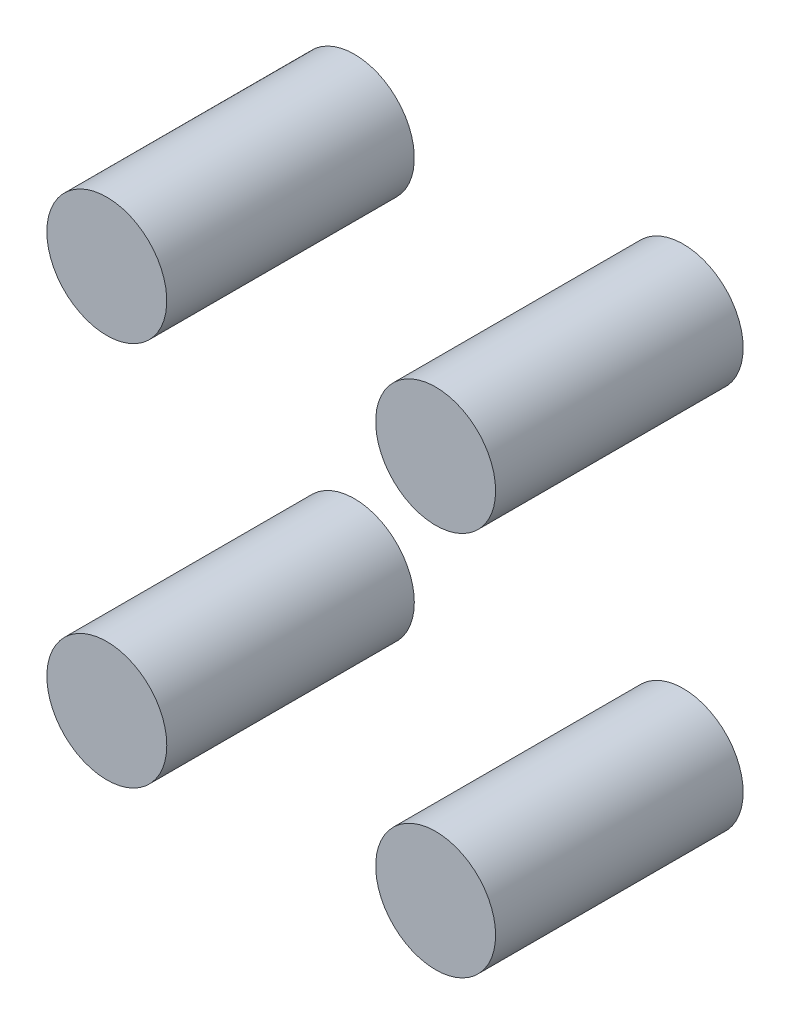
ISO-10303-21;
HEADER;
FILE_DESCRIPTION(('STEP AP214'),'2;1');
FILE_NAME('part.step','',(''),(''),'','','');
FILE_SCHEMA(('AUTOMOTIVE_DESIGN { 1 0 10303 214 1 1 1 1 }'));
ENDSEC;
DATA;
#1=APPLICATION_CONTEXT('core data for automotive mechanical design processes');
#2=APPLICATION_PROTOCOL_DEFINITION('international standard','automotive_design',2000,#1);
#3=PRODUCT_CONTEXT('',#1,'mechanical');
#4=PRODUCT('Part','Part','',(#3));
#5=PRODUCT_RELATED_PRODUCT_CATEGORY('part','',(#4));
#6=PRODUCT_DEFINITION_FORMATION('','',#4);
#7=PRODUCT_DEFINITION_CONTEXT('part definition',#1,'design');
#8=PRODUCT_DEFINITION('design','',#6,#7);
#9=PRODUCT_DEFINITION_SHAPE('','',#8);
#10=(LENGTH_UNIT() NAMED_UNIT(*) SI_UNIT(.MILLI.,.METRE.));
#11=(NAMED_UNIT(*) PLANE_ANGLE_UNIT() SI_UNIT($,.RADIAN.));
#12=(NAMED_UNIT(*) SI_UNIT($,.STERADIAN.) SOLID_ANGLE_UNIT());
#13=UNCERTAINTY_MEASURE_WITH_UNIT(LENGTH_MEASURE(1.E-05),#10,'distance_accuracy_value','');
#14=(GEOMETRIC_REPRESENTATION_CONTEXT(3) GLOBAL_UNCERTAINTY_ASSIGNED_CONTEXT((#13)) GLOBAL_UNIT_ASSIGNED_CONTEXT((#10,
#11,#12)) REPRESENTATION_CONTEXT('',''));
#15=CARTESIAN_POINT('',(0.,0.,0.));
#16=DIRECTION('',(0.,0.,1.));
#17=DIRECTION('',(1.,0.,0.));
#18=AXIS2_PLACEMENT_3D('',#15,#16,#17);
#19=CARTESIAN_POINT('',(-0.316192677665861,0.0503674559625203,40.));
#20=DIRECTION('',(0.,0.,-1.));
#21=DIRECTION('',(-1.,0.,0.));
#22=AXIS2_PLACEMENT_3D('',#19,#20,#21);
#23=CYLINDRICAL_SURFACE('',#22,9.68889965321614);
#24=CARTESIAN_POINT('',(-0.316192677665861,0.0503674559625203,40.));
#25=DIRECTION('',(0.,0.,1.));
#26=DIRECTION('',(1.,0.,0.));
#27=AXIS2_PLACEMENT_3D('',#24,#25,#26);
#28=CIRCLE('',#27,9.68889965321614);
#29=CARTESIAN_POINT('',(9.37270697555028,0.0503674559625203,40.));
#30=VERTEX_POINT('',#29);
#31=EDGE_CURVE('E48',#30,#30,#28,.T.);
#32=ORIENTED_EDGE('',*,*,#31,.F.);
#33=EDGE_LOOP('',(#32));
#34=FACE_BOUND('',#33,.T.);
#35=CARTESIAN_POINT('',(-0.316192677665861,0.0503674559625203,0.));
#36=DIRECTION('',(0.,0.,1.));
#37=DIRECTION('',(1.,0.,0.));
#38=AXIS2_PLACEMENT_3D('',#35,#36,#37);
#39=CIRCLE('',#38,9.68889965321614);
#40=CARTESIAN_POINT('',(9.37270697555028,0.0503674559625203,0.));
#41=VERTEX_POINT('',#40);
#42=EDGE_CURVE('E11',#41,#41,#39,.T.);
#43=ORIENTED_EDGE('',*,*,#42,.T.);
#44=EDGE_LOOP('',(#43));
#45=FACE_BOUND('',#44,.T.);
#46=ADVANCED_FACE('F44',(#34,#45),#23,.T.);
#47=CARTESIAN_POINT('',(-0.316192677665861,0.0503674559625203,40.));
#48=DIRECTION('',(0.,0.,1.));
#49=DIRECTION('',(1.,0.,0.));
#50=AXIS2_PLACEMENT_3D('',#47,#48,#49);
#51=PLANE('',#50);
#52=ORIENTED_EDGE('',*,*,#31,.T.);
#53=EDGE_LOOP('',(#52));
#54=FACE_BOUND('',#53,.T.);
#55=ADVANCED_FACE('F46',(#54),#51,.T.);
#56=CARTESIAN_POINT('',(-0.316192677665861,0.0503674559625203,0.));
#57=DIRECTION('',(0.,0.,1.));
#58=DIRECTION('',(1.,0.,0.));
#59=AXIS2_PLACEMENT_3D('',#56,#57,#58);
#60=PLANE('',#59);
#61=ORIENTED_EDGE('',*,*,#42,.F.);
#62=EDGE_LOOP('',(#61));
#63=FACE_BOUND('',#62,.T.);
#64=ADVANCED_FACE('F63',(#63),#60,.F.);
#65=CLOSED_SHELL('',(#46,#55,#64));
#66=MANIFOLD_SOLID_BREP('B2',#65);
#67=CARTESIAN_POINT('',(-0.316192677665861,62.2402998424397,40.));
#68=DIRECTION('',(0.,0.,-1.));
#69=DIRECTION('',(-1.,0.,0.));
#70=AXIS2_PLACEMENT_3D('',#67,#68,#69);
#71=CYLINDRICAL_SURFACE('',#70,9.68889965321615);
#72=CARTESIAN_POINT('',(-0.316192677665861,62.2402998424397,40.));
#73=DIRECTION('',(0.,0.,-1.));
#74=DIRECTION('',(-1.,0.,0.));
#75=AXIS2_PLACEMENT_3D('',#72,#73,#74);
#76=CIRCLE('',#75,9.68889965321615);
#77=CARTESIAN_POINT('',(-10.005092330882,62.2402998424397,40.));
#78=VERTEX_POINT('',#77);
#79=EDGE_CURVE('E103',#78,#78,#76,.T.);
#80=ORIENTED_EDGE('',*,*,#79,.T.);
#81=EDGE_LOOP('',(#80));
#82=FACE_BOUND('',#81,.T.);
#83=CARTESIAN_POINT('',(-0.316192677665861,62.2402998424397,0.));
#84=DIRECTION('',(0.,0.,-1.));
#85=DIRECTION('',(-1.,0.,0.));
#86=AXIS2_PLACEMENT_3D('',#83,#84,#85);
#87=CIRCLE('',#86,9.68889965321615);
#88=CARTESIAN_POINT('',(-10.005092330882,62.2402998424397,0.));
#89=VERTEX_POINT('',#88);
#90=EDGE_CURVE('E43',#89,#89,#87,.T.);
#91=ORIENTED_EDGE('',*,*,#90,.F.);
#92=EDGE_LOOP('',(#91));
#93=FACE_BOUND('',#92,.T.);
#94=ADVANCED_FACE('F99',(#82,#93),#71,.T.);
#95=CARTESIAN_POINT('',(-0.316192677665861,62.2402998424397,40.));
#96=DIRECTION('',(0.,0.,-1.));
#97=DIRECTION('',(-1.,0.,0.));
#98=AXIS2_PLACEMENT_3D('',#95,#96,#97);
#99=PLANE('',#98);
#100=ORIENTED_EDGE('',*,*,#79,.F.);
#101=EDGE_LOOP('',(#100));
#102=FACE_BOUND('',#101,.T.);
#103=ADVANCED_FACE('F101',(#102),#99,.F.);
#104=CARTESIAN_POINT('',(-0.316192677665861,62.2402998424397,0.));
#105=DIRECTION('',(0.,0.,-1.));
#106=DIRECTION('',(-1.,0.,0.));
#107=AXIS2_PLACEMENT_3D('',#104,#105,#106);
#108=PLANE('',#107);
#109=ORIENTED_EDGE('',*,*,#90,.T.);
#110=EDGE_LOOP('',(#109));
#111=FACE_BOUND('',#110,.T.);
#112=ADVANCED_FACE('F115',(#111),#108,.T.);
#113=CLOSED_SHELL('',(#94,#103,#112));
#114=MANIFOLD_SOLID_BREP('B6',#113);
#115=CARTESIAN_POINT('',(52.8185437823497,0.0503674559625203,40.));
#116=DIRECTION('',(0.,0.,-1.));
#117=DIRECTION('',(-1.,0.,0.));
#118=AXIS2_PLACEMENT_3D('',#115,#116,#117);
#119=CYLINDRICAL_SURFACE('',#118,9.68889965321615);
#120=CARTESIAN_POINT('',(52.8185437823497,0.0503674559625203,40.));
#121=DIRECTION('',(0.,0.,1.));
#122=DIRECTION('',(1.,0.,0.));
#123=AXIS2_PLACEMENT_3D('',#120,#121,#122);
#124=CIRCLE('',#123,9.68889965321615);
#125=CARTESIAN_POINT('',(62.5074434355659,0.0503674559625203,40.));
#126=VERTEX_POINT('',#125);
#127=EDGE_CURVE('E157',#126,#126,#124,.F.);
#128=ORIENTED_EDGE('',*,*,#127,.T.);
#129=EDGE_LOOP('',(#128));
#130=FACE_BOUND('',#129,.T.);
#131=CARTESIAN_POINT('',(52.8185437823497,0.0503674559625203,0.));
#132=DIRECTION('',(0.,0.,1.));
#133=DIRECTION('',(1.,0.,0.));
#134=AXIS2_PLACEMENT_3D('',#131,#132,#133);
#135=CIRCLE('',#134,9.68889965321615);
#136=CARTESIAN_POINT('',(62.5074434355659,0.0503674559625203,0.));
#137=VERTEX_POINT('',#136);
#138=EDGE_CURVE('E98',#137,#137,#135,.F.);
#139=ORIENTED_EDGE('',*,*,#138,.F.);
#140=EDGE_LOOP('',(#139));
#141=FACE_BOUND('',#140,.T.);
#142=ADVANCED_FACE('F153',(#130,#141),#119,.T.);
#143=CARTESIAN_POINT('',(0.,0.,40.));
#144=DIRECTION('',(0.,0.,1.));
#145=DIRECTION('',(1.,0.,0.));
#146=AXIS2_PLACEMENT_3D('',#143,#144,#145);
#147=PLANE('',#146);
#148=ORIENTED_EDGE('',*,*,#127,.F.);
#149=EDGE_LOOP('',(#148));
#150=FACE_BOUND('',#149,.T.);
#151=ADVANCED_FACE('F155',(#150),#147,.T.);
#152=CARTESIAN_POINT('',(0.,0.,0.));
#153=DIRECTION('',(0.,0.,1.));
#154=DIRECTION('',(1.,0.,0.));
#155=AXIS2_PLACEMENT_3D('',#152,#153,#154);
#156=PLANE('',#155);
#157=ORIENTED_EDGE('',*,*,#138,.T.);
#158=EDGE_LOOP('',(#157));
#159=FACE_BOUND('',#158,.T.);
#160=ADVANCED_FACE('F169',(#159),#156,.F.);
#161=CLOSED_SHELL('',(#142,#151,#160));
#162=MANIFOLD_SOLID_BREP('B38',#161);
#163=CARTESIAN_POINT('',(52.8185437823497,62.2402998424397,40.));
#164=DIRECTION('',(0.,0.,-1.));
#165=DIRECTION('',(-1.,0.,0.));
#166=AXIS2_PLACEMENT_3D('',#163,#164,#165);
#167=CYLINDRICAL_SURFACE('',#166,9.68889965321615);
#168=CARTESIAN_POINT('',(52.8185437823497,62.2402998424397,40.));
#169=DIRECTION('',(0.,0.,1.));
#170=DIRECTION('',(1.,0.,0.));
#171=AXIS2_PLACEMENT_3D('',#168,#169,#170);
#172=CIRCLE('',#171,9.68889965321615);
#173=CARTESIAN_POINT('',(62.5074434355659,62.2402998424397,40.));
#174=VERTEX_POINT('',#173);
#175=EDGE_CURVE('E152',#174,#174,#172,.T.);
#176=ORIENTED_EDGE('',*,*,#175,.F.);
#177=EDGE_LOOP('',(#176));
#178=FACE_BOUND('',#177,.T.);
#179=CARTESIAN_POINT('',(52.8185437823497,62.2402998424397,0.));
#180=DIRECTION('',(0.,0.,1.));
#181=DIRECTION('',(1.,0.,0.));
#182=AXIS2_PLACEMENT_3D('',#179,#180,#181);
#183=CIRCLE('',#182,9.68889965321615);
#184=CARTESIAN_POINT('',(62.5074434355659,62.2402998424397,0.));
#185=VERTEX_POINT('',#184);
#186=EDGE_CURVE('E203',#185,#185,#183,.T.);
#187=ORIENTED_EDGE('',*,*,#186,.T.);
#188=EDGE_LOOP('',(#187));
#189=FACE_BOUND('',#188,.T.);
#190=ADVANCED_FACE('F200',(#178,#189),#167,.T.);
#191=CARTESIAN_POINT('',(0.,0.,40.));
#192=DIRECTION('',(0.,0.,1.));
#193=DIRECTION('',(1.,0.,0.));
#194=AXIS2_PLACEMENT_3D('',#191,#192,#193);
#195=PLANE('',#194);
#196=ORIENTED_EDGE('',*,*,#175,.T.);
#197=EDGE_LOOP('',(#196));
#198=FACE_BOUND('',#197,.T.);
#199=ADVANCED_FACE('F215',(#198),#195,.T.);
#200=CARTESIAN_POINT('',(0.,0.,0.));
#201=DIRECTION('',(0.,0.,1.));
#202=DIRECTION('',(1.,0.,0.));
#203=AXIS2_PLACEMENT_3D('',#200,#201,#202);
#204=PLANE('',#203);
#205=ORIENTED_EDGE('',*,*,#186,.F.);
#206=EDGE_LOOP('',(#205));
#207=FACE_BOUND('',#206,.T.);
#208=ADVANCED_FACE('F213',(#207),#204,.F.);
#209=CLOSED_SHELL('',(#190,#199,#208));
#210=MANIFOLD_SOLID_BREP('B93',#209);
#211=ADVANCED_BREP_SHAPE_REPRESENTATION('',(#18,#66,#114,#162,#210),#14);
#212=SHAPE_DEFINITION_REPRESENTATION(#9,#211);
ENDSEC;
END-ISO-10303-21;
